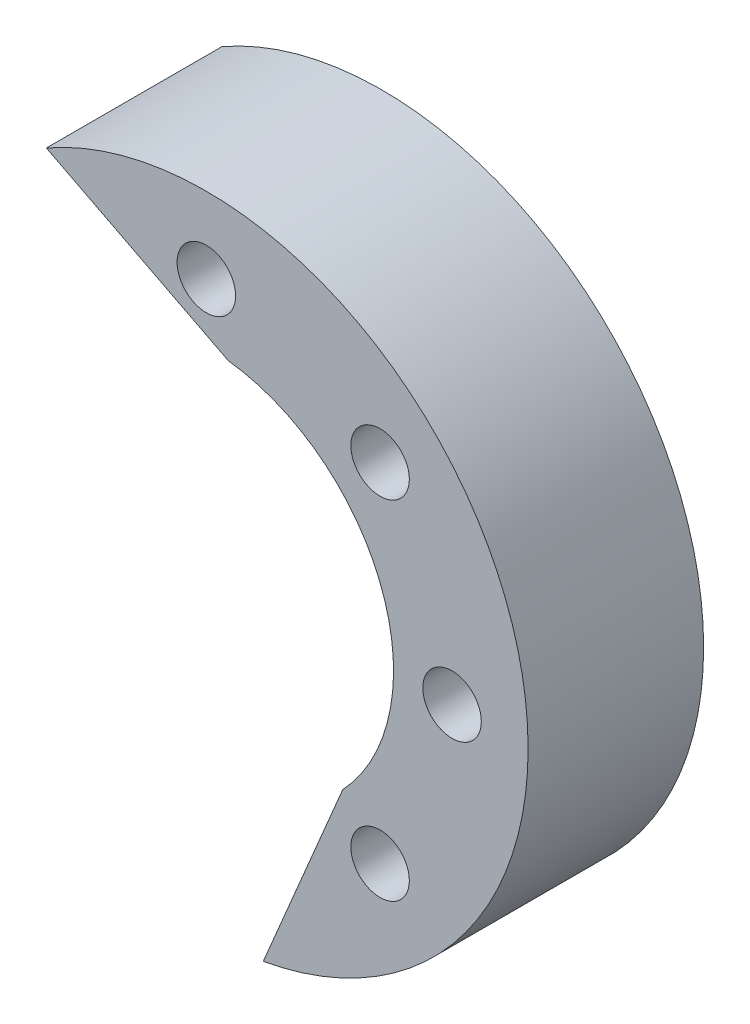
ISO-10303-21;
HEADER;
FILE_DESCRIPTION(('STEP AP214'),'2;1');
FILE_NAME('part.step','',(''),(''),'','','');
FILE_SCHEMA(('AUTOMOTIVE_DESIGN { 1 0 10303 214 1 1 1 1 }'));
ENDSEC;
DATA;
#1=APPLICATION_CONTEXT('core data for automotive mechanical design processes');
#2=APPLICATION_PROTOCOL_DEFINITION('international standard','automotive_design',2000,#1);
#3=PRODUCT_CONTEXT('',#1,'mechanical');
#4=PRODUCT('Part','Part','',(#3));
#5=PRODUCT_RELATED_PRODUCT_CATEGORY('part','',(#4));
#6=PRODUCT_DEFINITION_FORMATION('','',#4);
#7=PRODUCT_DEFINITION_CONTEXT('part definition',#1,'design');
#8=PRODUCT_DEFINITION('design','',#6,#7);
#9=PRODUCT_DEFINITION_SHAPE('','',#8);
#10=(LENGTH_UNIT() NAMED_UNIT(*) SI_UNIT(.MILLI.,.METRE.));
#11=(NAMED_UNIT(*) PLANE_ANGLE_UNIT() SI_UNIT($,.RADIAN.));
#12=(NAMED_UNIT(*) SI_UNIT($,.STERADIAN.) SOLID_ANGLE_UNIT());
#13=UNCERTAINTY_MEASURE_WITH_UNIT(LENGTH_MEASURE(1.E-05),#10,'distance_accuracy_value','');
#14=(GEOMETRIC_REPRESENTATION_CONTEXT(3) GLOBAL_UNCERTAINTY_ASSIGNED_CONTEXT((#13)) GLOBAL_UNIT_ASSIGNED_CONTEXT((#10,
#11,#12)) REPRESENTATION_CONTEXT('',''));
#15=CARTESIAN_POINT('',(0.,0.,0.));
#16=DIRECTION('',(0.,0.,1.));
#17=DIRECTION('',(1.,0.,0.));
#18=AXIS2_PLACEMENT_3D('',#15,#16,#17);
#19=CARTESIAN_POINT('',(29.698484809835,-29.698484809835,30.));
#20=DIRECTION('',(0.,0.,1.));
#21=DIRECTION('',(1.,0.,0.));
#22=AXIS2_PLACEMENT_3D('',#19,#20,#21);
#23=CYLINDRICAL_SURFACE('',#22,2.09999999999999);
#24=CARTESIAN_POINT('',(29.698484809835,-29.698484809835,0.));
#25=DIRECTION('',(0.,0.,1.));
#26=DIRECTION('',(1.,0.,0.));
#27=AXIS2_PLACEMENT_3D('',#24,#25,#26);
#28=CIRCLE('',#27,2.09999999999999);
#29=CARTESIAN_POINT('',(31.798484809835,-29.698484809835,0.));
#30=VERTEX_POINT('',#29);
#31=EDGE_CURVE('E107',#30,#30,#28,.T.);
#32=ORIENTED_EDGE('',*,*,#31,.F.);
#33=EDGE_LOOP('',(#32));
#34=FACE_BOUND('',#33,.T.);
#35=CARTESIAN_POINT('',(29.698484809835,-29.698484809835,10.));
#36=DIRECTION('',(0.,0.,1.));
#37=DIRECTION('',(1.,0.,0.));
#38=AXIS2_PLACEMENT_3D('',#35,#36,#37);
#39=CIRCLE('',#38,2.09999999999999);
#40=CARTESIAN_POINT('',(31.798484809835,-29.698484809835,10.));
#41=VERTEX_POINT('',#40);
#42=EDGE_CURVE('E41',#41,#41,#39,.F.);
#43=ORIENTED_EDGE('',*,*,#42,.F.);
#44=EDGE_LOOP('',(#43));
#45=FACE_BOUND('',#44,.T.);
#46=ADVANCED_FACE('F37',(#34,#45),#23,.F.);
#47=CARTESIAN_POINT('',(42.,0.,30.));
#48=DIRECTION('',(0.,0.,1.));
#49=DIRECTION('',(1.,0.,0.));
#50=AXIS2_PLACEMENT_3D('',#47,#48,#49);
#51=CYLINDRICAL_SURFACE('',#50,2.09999999999999);
#52=CARTESIAN_POINT('',(42.,0.,0.));
#53=DIRECTION('',(0.,0.,1.));
#54=DIRECTION('',(1.,0.,0.));
#55=AXIS2_PLACEMENT_3D('',#52,#53,#54);
#56=CIRCLE('',#55,2.09999999999999);
#57=CARTESIAN_POINT('',(44.1,0.,0.));
#58=VERTEX_POINT('',#57);
#59=EDGE_CURVE('E133',#58,#58,#56,.T.);
#60=ORIENTED_EDGE('',*,*,#59,.F.);
#61=EDGE_LOOP('',(#60));
#62=FACE_BOUND('',#61,.T.);
#63=CARTESIAN_POINT('',(42.,0.,10.));
#64=DIRECTION('',(0.,0.,1.));
#65=DIRECTION('',(1.,0.,0.));
#66=AXIS2_PLACEMENT_3D('',#63,#64,#65);
#67=CIRCLE('',#66,2.09999999999999);
#68=CARTESIAN_POINT('',(44.1,0.,10.));
#69=VERTEX_POINT('',#68);
#70=EDGE_CURVE('E119',#69,#69,#67,.F.);
#71=ORIENTED_EDGE('',*,*,#70,.F.);
#72=EDGE_LOOP('',(#71));
#73=FACE_BOUND('',#72,.T.);
#74=ADVANCED_FACE('F149',(#62,#73),#51,.F.);
#75=CARTESIAN_POINT('',(29.698484809835,29.698484809835,30.));
#76=DIRECTION('',(0.,0.,1.));
#77=DIRECTION('',(1.,0.,0.));
#78=AXIS2_PLACEMENT_3D('',#75,#76,#77);
#79=CYLINDRICAL_SURFACE('',#78,2.09999999999999);
#80=CARTESIAN_POINT('',(29.698484809835,29.698484809835,0.));
#81=DIRECTION('',(0.,0.,1.));
#82=DIRECTION('',(1.,0.,0.));
#83=AXIS2_PLACEMENT_3D('',#80,#81,#82);
#84=CIRCLE('',#83,2.09999999999999);
#85=CARTESIAN_POINT('',(31.798484809835,29.698484809835,0.));
#86=VERTEX_POINT('',#85);
#87=EDGE_CURVE('E128',#86,#86,#84,.T.);
#88=ORIENTED_EDGE('',*,*,#87,.F.);
#89=EDGE_LOOP('',(#88));
#90=FACE_BOUND('',#89,.T.);
#91=CARTESIAN_POINT('',(29.698484809835,29.698484809835,10.));
#92=DIRECTION('',(0.,0.,1.));
#93=DIRECTION('',(1.,0.,0.));
#94=AXIS2_PLACEMENT_3D('',#91,#92,#93);
#95=CIRCLE('',#94,2.09999999999999);
#96=CARTESIAN_POINT('',(31.798484809835,29.698484809835,10.));
#97=VERTEX_POINT('',#96);
#98=EDGE_CURVE('E116',#97,#97,#95,.F.);
#99=ORIENTED_EDGE('',*,*,#98,.F.);
#100=EDGE_LOOP('',(#99));
#101=FACE_BOUND('',#100,.T.);
#102=ADVANCED_FACE('F154',(#90,#101),#79,.F.);
#103=CARTESIAN_POINT('',(0.,42.,30.));
#104=DIRECTION('',(0.,0.,1.));
#105=DIRECTION('',(1.,0.,0.));
#106=AXIS2_PLACEMENT_3D('',#103,#104,#105);
#107=CYLINDRICAL_SURFACE('',#106,2.09999999999999);
#108=CARTESIAN_POINT('',(0.,42.,0.));
#109=DIRECTION('',(0.,0.,1.));
#110=DIRECTION('',(1.,0.,0.));
#111=AXIS2_PLACEMENT_3D('',#108,#109,#110);
#112=CIRCLE('',#111,2.09999999999999);
#113=CARTESIAN_POINT('',(2.09999999999999,42.,0.));
#114=VERTEX_POINT('',#113);
#115=EDGE_CURVE('E124',#114,#114,#112,.T.);
#116=ORIENTED_EDGE('',*,*,#115,.F.);
#117=EDGE_LOOP('',(#116));
#118=FACE_BOUND('',#117,.T.);
#119=CARTESIAN_POINT('',(0.,42.,10.));
#120=DIRECTION('',(0.,0.,1.));
#121=DIRECTION('',(1.,0.,0.));
#122=AXIS2_PLACEMENT_3D('',#119,#120,#121);
#123=CIRCLE('',#122,2.09999999999999);
#124=CARTESIAN_POINT('',(2.09999999999999,42.,10.));
#125=VERTEX_POINT('',#124);
#126=EDGE_CURVE('E113',#125,#125,#123,.F.);
#127=ORIENTED_EDGE('',*,*,#126,.F.);
#128=EDGE_LOOP('',(#127));
#129=FACE_BOUND('',#128,.T.);
#130=ADVANCED_FACE('F173',(#118,#129),#107,.F.);
#131=CARTESIAN_POINT('',(0.,0.,30.));
#132=DIRECTION('',(0.,0.,-1.));
#133=DIRECTION('',(-1.,0.,0.));
#134=AXIS2_PLACEMENT_3D('',#131,#132,#133);
#135=CYLINDRICAL_SURFACE('',#134,55.);
#136=CARTESIAN_POINT('',(0.,0.,0.));
#137=DIRECTION('',(0.,0.,1.));
#138=DIRECTION('',(1.,0.,0.));
#139=AXIS2_PLACEMENT_3D('',#136,#137,#138);
#140=CIRCLE('',#139,55.);
#141=CARTESIAN_POINT('',(9.72997409676618,-54.1325004417518,0.));
#142=VERTEX_POINT('',#141);
#143=CARTESIAN_POINT('',(-27.3421079767901,47.7222079475117,0.));
#144=VERTEX_POINT('',#143);
#145=EDGE_CURVE('E104',#142,#144,#140,.T.);
#146=ORIENTED_EDGE('',*,*,#145,.T.);
#147=DIRECTION('',(0.,0.,-1.));
#148=VECTOR('',#147,1.);
#149=CARTESIAN_POINT('',(-27.3421079767901,47.7222079475117,30.));
#150=LINE('',#149,#148);
#151=CARTESIAN_POINT('',(-27.3421079767901,47.7222079475117,30.));
#152=VERTEX_POINT('',#151);
#153=EDGE_CURVE('E11',#152,#144,#150,.T.);
#154=ORIENTED_EDGE('',*,*,#153,.F.);
#155=CARTESIAN_POINT('',(0.,0.,30.));
#156=DIRECTION('',(0.,0.,1.));
#157=DIRECTION('',(1.,0.,0.));
#158=AXIS2_PLACEMENT_3D('',#155,#156,#157);
#159=CIRCLE('',#158,55.);
#160=CARTESIAN_POINT('',(9.72997409676618,-54.1325004417518,30.));
#161=VERTEX_POINT('',#160);
#162=EDGE_CURVE('E91',#161,#152,#159,.T.);
#163=ORIENTED_EDGE('',*,*,#162,.F.);
#164=DIRECTION('',(0.,0.,-1.));
#165=VECTOR('',#164,1.);
#166=CARTESIAN_POINT('',(9.72997409676618,-54.1325004417518,30.));
#167=LINE('',#166,#165);
#168=EDGE_CURVE('E100',#161,#142,#167,.T.);
#169=ORIENTED_EDGE('',*,*,#168,.T.);
#170=EDGE_LOOP('',(#146,#154,#163,#169));
#171=FACE_BOUND('',#170,.T.);
#172=ADVANCED_FACE('F39',(#171),#135,.T.);
#173=CARTESIAN_POINT('',(-27.3421079767901,47.7222079475117,30.));
#174=DIRECTION('',(0.456073338696727,0.889942194600313,0.));
#175=DIRECTION('',(-0.889942194600313,0.456073338696727,0.));
#176=AXIS2_PLACEMENT_3D('',#173,#174,#175);
#177=PLANE('',#176);
#178=DIRECTION('',(0.889942194600313,-0.456073338696727,0.));
#179=VECTOR('',#178,1.);
#180=CARTESIAN_POINT('',(-27.3421079767901,47.7222079475117,0.));
#181=LINE('',#180,#179);
#182=CARTESIAN_POINT('',(3.77222328875304,31.7768836020745,0.));
#183=VERTEX_POINT('',#182);
#184=EDGE_CURVE('E95',#144,#183,#181,.T.);
#185=ORIENTED_EDGE('',*,*,#184,.T.);
#186=DIRECTION('',(0.,0.,-1.));
#187=VECTOR('',#186,1.);
#188=CARTESIAN_POINT('',(3.77222328875304,31.7768836020745,30.));
#189=LINE('',#188,#187);
#190=CARTESIAN_POINT('',(3.77222328875304,31.7768836020745,30.));
#191=VERTEX_POINT('',#190);
#192=EDGE_CURVE('E47',#191,#183,#189,.T.);
#193=ORIENTED_EDGE('',*,*,#192,.F.);
#194=DIRECTION('',(0.889942194600313,-0.456073338696727,0.));
#195=VECTOR('',#194,1.);
#196=CARTESIAN_POINT('',(-27.3421079767901,47.7222079475117,30.));
#197=LINE('',#196,#195);
#198=EDGE_CURVE('E86',#152,#191,#197,.T.);
#199=ORIENTED_EDGE('',*,*,#198,.F.);
#200=ORIENTED_EDGE('',*,*,#153,.T.);
#201=EDGE_LOOP('',(#185,#193,#199,#200));
#202=FACE_BOUND('',#201,.T.);
#203=ADVANCED_FACE('F94',(#202),#177,.F.);
#204=CARTESIAN_POINT('',(0.,0.,30.));
#205=DIRECTION('',(0.,0.,-1.));
#206=DIRECTION('',(-1.,0.,0.));
#207=AXIS2_PLACEMENT_3D('',#204,#205,#206);
#208=CYLINDRICAL_SURFACE('',#207,32.);
#209=CARTESIAN_POINT('',(0.,0.,0.));
#210=DIRECTION('',(0.,0.,-1.));
#211=DIRECTION('',(1.,0.,0.));
#212=AXIS2_PLACEMENT_3D('',#209,#210,#211);
#213=CIRCLE('',#212,32.);
#214=CARTESIAN_POINT('',(23.3154777424182,-21.9177667120261,0.));
#215=VERTEX_POINT('',#214);
#216=EDGE_CURVE('E73',#183,#215,#213,.T.);
#217=ORIENTED_EDGE('',*,*,#216,.T.);
#218=DIRECTION('',(0.,0.,-1.));
#219=VECTOR('',#218,1.);
#220=CARTESIAN_POINT('',(23.3154777424182,-21.9177667120261,30.));
#221=LINE('',#220,#219);
#222=CARTESIAN_POINT('',(23.3154777424182,-21.9177667120261,30.));
#223=VERTEX_POINT('',#222);
#224=EDGE_CURVE('E96',#223,#215,#221,.T.);
#225=ORIENTED_EDGE('',*,*,#224,.F.);
#226=CARTESIAN_POINT('',(0.,0.,30.));
#227=DIRECTION('',(0.,0.,-1.));
#228=DIRECTION('',(1.,0.,0.));
#229=AXIS2_PLACEMENT_3D('',#226,#227,#228);
#230=CIRCLE('',#229,32.);
#231=EDGE_CURVE('E89',#191,#223,#230,.T.);
#232=ORIENTED_EDGE('',*,*,#231,.F.);
#233=ORIENTED_EDGE('',*,*,#192,.T.);
#234=EDGE_LOOP('',(#217,#225,#232,#233));
#235=FACE_BOUND('',#234,.T.);
#236=ADVANCED_FACE('F98',(#235),#208,.F.);
#237=CARTESIAN_POINT('',(9.72997409676618,-54.1325004417518,30.));
#238=DIRECTION('',(0.921416262789677,-0.388576981648044,0.));
#239=DIRECTION('',(0.388576981648044,0.921416262789678,0.));
#240=AXIS2_PLACEMENT_3D('',#237,#238,#239);
#241=PLANE('',#240);
#242=DIRECTION('',(-0.388576981648044,-0.921416262789677,0.));
#243=VECTOR('',#242,1.);
#244=CARTESIAN_POINT('',(9.72997409676618,-54.1325004417518,0.));
#245=LINE('',#244,#243);
#246=EDGE_CURVE('E79',#215,#142,#245,.T.);
#247=ORIENTED_EDGE('',*,*,#246,.T.);
#248=ORIENTED_EDGE('',*,*,#168,.F.);
#249=DIRECTION('',(-0.388576981648044,-0.921416262789677,0.));
#250=VECTOR('',#249,1.);
#251=CARTESIAN_POINT('',(9.72997409676618,-54.1325004417518,30.));
#252=LINE('',#251,#250);
#253=EDGE_CURVE('E56',#223,#161,#252,.T.);
#254=ORIENTED_EDGE('',*,*,#253,.F.);
#255=ORIENTED_EDGE('',*,*,#224,.T.);
#256=EDGE_LOOP('',(#247,#248,#254,#255));
#257=FACE_BOUND('',#256,.T.);
#258=ADVANCED_FACE('F161',(#257),#241,.F.);
#259=CARTESIAN_POINT('',(0.,0.,30.));
#260=DIRECTION('',(0.,0.,1.));
#261=DIRECTION('',(1.,0.,0.));
#262=AXIS2_PLACEMENT_3D('',#259,#260,#261);
#263=PLANE('',#262);
#264=CARTESIAN_POINT('',(0.,42.,30.));
#265=DIRECTION('',(0.,0.,1.));
#266=DIRECTION('',(1.,0.,0.));
#267=AXIS2_PLACEMENT_3D('',#264,#265,#266);
#268=CIRCLE('',#267,5.);
#269=CARTESIAN_POINT('',(5.,42.,30.));
#270=VERTEX_POINT('',#269);
#271=EDGE_CURVE('E223',#270,#270,#268,.T.);
#272=ORIENTED_EDGE('',*,*,#271,.F.);
#273=EDGE_LOOP('',(#272));
#274=FACE_BOUND('',#273,.T.);
#275=CARTESIAN_POINT('',(29.698484809835,29.698484809835,30.));
#276=DIRECTION('',(0.,0.,1.));
#277=DIRECTION('',(1.,0.,0.));
#278=AXIS2_PLACEMENT_3D('',#275,#276,#277);
#279=CIRCLE('',#278,5.);
#280=CARTESIAN_POINT('',(34.698484809835,29.698484809835,30.));
#281=VERTEX_POINT('',#280);
#282=EDGE_CURVE('E231',#281,#281,#279,.T.);
#283=ORIENTED_EDGE('',*,*,#282,.F.);
#284=EDGE_LOOP('',(#283));
#285=FACE_BOUND('',#284,.T.);
#286=CARTESIAN_POINT('',(42.,0.,30.));
#287=DIRECTION('',(0.,0.,1.));
#288=DIRECTION('',(1.,0.,0.));
#289=AXIS2_PLACEMENT_3D('',#286,#287,#288);
#290=CIRCLE('',#289,5.);
#291=CARTESIAN_POINT('',(47.,0.,30.));
#292=VERTEX_POINT('',#291);
#293=EDGE_CURVE('E237',#292,#292,#290,.T.);
#294=ORIENTED_EDGE('',*,*,#293,.F.);
#295=EDGE_LOOP('',(#294));
#296=FACE_BOUND('',#295,.T.);
#297=CARTESIAN_POINT('',(29.698484809835,-29.698484809835,30.));
#298=DIRECTION('',(0.,0.,1.));
#299=DIRECTION('',(1.,0.,0.));
#300=AXIS2_PLACEMENT_3D('',#297,#298,#299);
#301=CIRCLE('',#300,5.);
#302=CARTESIAN_POINT('',(34.698484809835,-29.698484809835,30.));
#303=VERTEX_POINT('',#302);
#304=EDGE_CURVE('E136',#303,#303,#301,.T.);
#305=ORIENTED_EDGE('',*,*,#304,.F.);
#306=EDGE_LOOP('',(#305));
#307=FACE_BOUND('',#306,.T.);
#308=ORIENTED_EDGE('',*,*,#162,.T.);
#309=ORIENTED_EDGE('',*,*,#198,.T.);
#310=ORIENTED_EDGE('',*,*,#231,.T.);
#311=ORIENTED_EDGE('',*,*,#253,.T.);
#312=EDGE_LOOP('',(#308,#309,#310,#311));
#313=FACE_BOUND('',#312,.T.);
#314=ADVANCED_FACE('F87',(#274,#285,#296,#307,#313),#263,.T.);
#315=CARTESIAN_POINT('',(0.,0.,0.));
#316=DIRECTION('',(0.,0.,1.));
#317=DIRECTION('',(1.,0.,0.));
#318=AXIS2_PLACEMENT_3D('',#315,#316,#317);
#319=PLANE('',#318);
#320=ORIENTED_EDGE('',*,*,#115,.T.);
#321=EDGE_LOOP('',(#320));
#322=FACE_BOUND('',#321,.T.);
#323=ORIENTED_EDGE('',*,*,#87,.T.);
#324=EDGE_LOOP('',(#323));
#325=FACE_BOUND('',#324,.T.);
#326=ORIENTED_EDGE('',*,*,#59,.T.);
#327=EDGE_LOOP('',(#326));
#328=FACE_BOUND('',#327,.T.);
#329=ORIENTED_EDGE('',*,*,#31,.T.);
#330=EDGE_LOOP('',(#329));
#331=FACE_BOUND('',#330,.T.);
#332=ORIENTED_EDGE('',*,*,#145,.F.);
#333=ORIENTED_EDGE('',*,*,#246,.F.);
#334=ORIENTED_EDGE('',*,*,#216,.F.);
#335=ORIENTED_EDGE('',*,*,#184,.F.);
#336=EDGE_LOOP('',(#332,#333,#334,#335));
#337=FACE_BOUND('',#336,.T.);
#338=ADVANCED_FACE('F144',(#322,#325,#328,#331,#337),#319,.F.);
#339=CARTESIAN_POINT('',(0.,42.,10.));
#340=DIRECTION('',(0.,0.,1.));
#341=DIRECTION('',(1.,0.,0.));
#342=AXIS2_PLACEMENT_3D('',#339,#340,#341);
#343=PLANE('',#342);
#344=CARTESIAN_POINT('',(0.,42.,10.));
#345=DIRECTION('',(0.,0.,1.));
#346=DIRECTION('',(1.,0.,0.));
#347=AXIS2_PLACEMENT_3D('',#344,#345,#346);
#348=CIRCLE('',#347,5.);
#349=CARTESIAN_POINT('',(5.,42.,10.));
#350=VERTEX_POINT('',#349);
#351=EDGE_CURVE('E117',#350,#350,#348,.T.);
#352=ORIENTED_EDGE('',*,*,#351,.T.);
#353=EDGE_LOOP('',(#352));
#354=FACE_BOUND('',#353,.T.);
#355=ORIENTED_EDGE('',*,*,#126,.T.);
#356=EDGE_LOOP('',(#355));
#357=FACE_BOUND('',#356,.T.);
#358=ADVANCED_FACE('F165',(#354,#357),#343,.T.);
#359=CARTESIAN_POINT('',(0.,42.,10.));
#360=DIRECTION('',(0.,0.,1.));
#361=DIRECTION('',(1.,0.,0.));
#362=AXIS2_PLACEMENT_3D('',#359,#360,#361);
#363=CYLINDRICAL_SURFACE('',#362,5.);
#364=ORIENTED_EDGE('',*,*,#351,.F.);
#365=EDGE_LOOP('',(#364));
#366=FACE_BOUND('',#365,.T.);
#367=ORIENTED_EDGE('',*,*,#271,.T.);
#368=EDGE_LOOP('',(#367));
#369=FACE_BOUND('',#368,.T.);
#370=ADVANCED_FACE('F210',(#366,#369),#363,.F.);
#371=CARTESIAN_POINT('',(29.698484809835,29.698484809835,10.));
#372=DIRECTION('',(0.,0.,1.));
#373=DIRECTION('',(1.,0.,0.));
#374=AXIS2_PLACEMENT_3D('',#371,#372,#373);
#375=PLANE('',#374);
#376=CARTESIAN_POINT('',(29.698484809835,29.698484809835,10.));
#377=DIRECTION('',(0.,0.,1.));
#378=DIRECTION('',(1.,0.,0.));
#379=AXIS2_PLACEMENT_3D('',#376,#377,#378);
#380=CIRCLE('',#379,5.);
#381=CARTESIAN_POINT('',(34.698484809835,29.698484809835,10.));
#382=VERTEX_POINT('',#381);
#383=EDGE_CURVE('E226',#382,#382,#380,.T.);
#384=ORIENTED_EDGE('',*,*,#383,.T.);
#385=EDGE_LOOP('',(#384));
#386=FACE_BOUND('',#385,.T.);
#387=ORIENTED_EDGE('',*,*,#98,.T.);
#388=EDGE_LOOP('',(#387));
#389=FACE_BOUND('',#388,.T.);
#390=ADVANCED_FACE('F206',(#386,#389),#375,.T.);
#391=CARTESIAN_POINT('',(29.698484809835,29.698484809835,10.));
#392=DIRECTION('',(0.,0.,1.));
#393=DIRECTION('',(1.,0.,0.));
#394=AXIS2_PLACEMENT_3D('',#391,#392,#393);
#395=CYLINDRICAL_SURFACE('',#394,5.);
#396=ORIENTED_EDGE('',*,*,#383,.F.);
#397=EDGE_LOOP('',(#396));
#398=FACE_BOUND('',#397,.T.);
#399=ORIENTED_EDGE('',*,*,#282,.T.);
#400=EDGE_LOOP('',(#399));
#401=FACE_BOUND('',#400,.T.);
#402=ADVANCED_FACE('F202',(#398,#401),#395,.F.);
#403=CARTESIAN_POINT('',(42.,0.,10.));
#404=DIRECTION('',(0.,0.,1.));
#405=DIRECTION('',(1.,0.,0.));
#406=AXIS2_PLACEMENT_3D('',#403,#404,#405);
#407=PLANE('',#406);
#408=CARTESIAN_POINT('',(42.,0.,10.));
#409=DIRECTION('',(0.,0.,1.));
#410=DIRECTION('',(1.,0.,0.));
#411=AXIS2_PLACEMENT_3D('',#408,#409,#410);
#412=CIRCLE('',#411,5.);
#413=CARTESIAN_POINT('',(47.,0.,10.));
#414=VERTEX_POINT('',#413);
#415=EDGE_CURVE('E234',#414,#414,#412,.T.);
#416=ORIENTED_EDGE('',*,*,#415,.T.);
#417=EDGE_LOOP('',(#416));
#418=FACE_BOUND('',#417,.T.);
#419=ORIENTED_EDGE('',*,*,#70,.T.);
#420=EDGE_LOOP('',(#419));
#421=FACE_BOUND('',#420,.T.);
#422=ADVANCED_FACE('F198',(#418,#421),#407,.T.);
#423=CARTESIAN_POINT('',(42.,0.,10.));
#424=DIRECTION('',(0.,0.,1.));
#425=DIRECTION('',(1.,0.,0.));
#426=AXIS2_PLACEMENT_3D('',#423,#424,#425);
#427=CYLINDRICAL_SURFACE('',#426,5.);
#428=ORIENTED_EDGE('',*,*,#415,.F.);
#429=EDGE_LOOP('',(#428));
#430=FACE_BOUND('',#429,.T.);
#431=ORIENTED_EDGE('',*,*,#293,.T.);
#432=EDGE_LOOP('',(#431));
#433=FACE_BOUND('',#432,.T.);
#434=ADVANCED_FACE('F194',(#430,#433),#427,.F.);
#435=CARTESIAN_POINT('',(29.698484809835,-29.698484809835,10.));
#436=DIRECTION('',(0.,0.,1.));
#437=DIRECTION('',(1.,0.,0.));
#438=AXIS2_PLACEMENT_3D('',#435,#436,#437);
#439=PLANE('',#438);
#440=CARTESIAN_POINT('',(29.698484809835,-29.698484809835,10.));
#441=DIRECTION('',(0.,0.,1.));
#442=DIRECTION('',(1.,0.,0.));
#443=AXIS2_PLACEMENT_3D('',#440,#441,#442);
#444=CIRCLE('',#443,5.);
#445=CARTESIAN_POINT('',(34.698484809835,-29.698484809835,10.));
#446=VERTEX_POINT('',#445);
#447=EDGE_CURVE('E239',#446,#446,#444,.T.);
#448=ORIENTED_EDGE('',*,*,#447,.T.);
#449=EDGE_LOOP('',(#448));
#450=FACE_BOUND('',#449,.T.);
#451=ORIENTED_EDGE('',*,*,#42,.T.);
#452=EDGE_LOOP('',(#451));
#453=FACE_BOUND('',#452,.T.);
#454=ADVANCED_FACE('F190',(#450,#453),#439,.T.);
#455=CARTESIAN_POINT('',(29.698484809835,-29.698484809835,10.));
#456=DIRECTION('',(0.,0.,1.));
#457=DIRECTION('',(1.,0.,0.));
#458=AXIS2_PLACEMENT_3D('',#455,#456,#457);
#459=CYLINDRICAL_SURFACE('',#458,5.);
#460=ORIENTED_EDGE('',*,*,#447,.F.);
#461=EDGE_LOOP('',(#460));
#462=FACE_BOUND('',#461,.T.);
#463=ORIENTED_EDGE('',*,*,#304,.T.);
#464=EDGE_LOOP('',(#463));
#465=FACE_BOUND('',#464,.T.);
#466=ADVANCED_FACE('F187',(#462,#465),#459,.F.);
#467=CLOSED_SHELL('',(#46,#74,#102,#130,#172,#203,#236,#258,#314,#338,#358,#370,#390,#402,#422,
#434,#454,#466));
#468=MANIFOLD_SOLID_BREP('B2',#467);
#469=ADVANCED_BREP_SHAPE_REPRESENTATION('',(#18,#468),#14);
#470=SHAPE_DEFINITION_REPRESENTATION(#9,#469);
ENDSEC;
END-ISO-10303-21;
